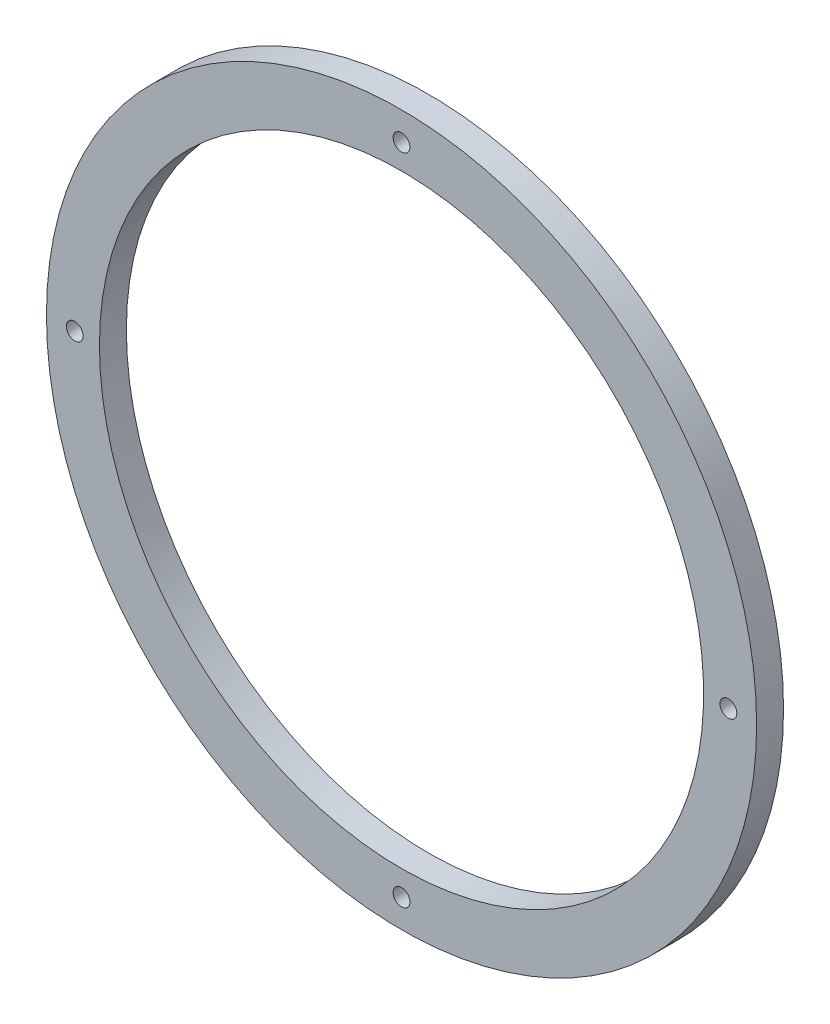
ISO-10303-21;
HEADER;
FILE_DESCRIPTION(('STEP AP214'),'2;1');
FILE_NAME('part.step','',(''),(''),'','','');
FILE_SCHEMA(('AUTOMOTIVE_DESIGN { 1 0 10303 214 1 1 1 1 }'));
ENDSEC;
DATA;
#1=APPLICATION_CONTEXT('core data for automotive mechanical design processes');
#2=APPLICATION_PROTOCOL_DEFINITION('international standard','automotive_design',2000,#1);
#3=PRODUCT_CONTEXT('',#1,'mechanical');
#4=PRODUCT('Part','Part','',(#3));
#5=PRODUCT_RELATED_PRODUCT_CATEGORY('part','',(#4));
#6=PRODUCT_DEFINITION_FORMATION('','',#4);
#7=PRODUCT_DEFINITION_CONTEXT('part definition',#1,'design');
#8=PRODUCT_DEFINITION('design','',#6,#7);
#9=PRODUCT_DEFINITION_SHAPE('','',#8);
#10=(LENGTH_UNIT() NAMED_UNIT(*) SI_UNIT(.MILLI.,.METRE.));
#11=(NAMED_UNIT(*) PLANE_ANGLE_UNIT() SI_UNIT($,.RADIAN.));
#12=(NAMED_UNIT(*) SI_UNIT($,.STERADIAN.) SOLID_ANGLE_UNIT());
#13=UNCERTAINTY_MEASURE_WITH_UNIT(LENGTH_MEASURE(1.E-05),#10,'distance_accuracy_value','');
#14=(GEOMETRIC_REPRESENTATION_CONTEXT(3) GLOBAL_UNCERTAINTY_ASSIGNED_CONTEXT((#13)) GLOBAL_UNIT_ASSIGNED_CONTEXT((#10,
#11,#12)) REPRESENTATION_CONTEXT('',''));
#15=CARTESIAN_POINT('',(0.,0.,0.));
#16=DIRECTION('',(0.,0.,1.));
#17=DIRECTION('',(1.,0.,0.));
#18=AXIS2_PLACEMENT_3D('',#15,#16,#17);
#19=CARTESIAN_POINT('',(0.,0.,7.62));
#20=DIRECTION('',(0.,0.,1.));
#21=DIRECTION('',(1.,0.,0.));
#22=AXIS2_PLACEMENT_3D('',#19,#20,#21);
#23=PLANE('',#22);
#24=CARTESIAN_POINT('',(0.,-92.5,7.62));
#25=DIRECTION('',(0.,0.,1.));
#26=DIRECTION('',(1.,0.,0.));
#27=AXIS2_PLACEMENT_3D('',#24,#25,#26);
#28=CIRCLE('',#27,2.38125);
#29=CARTESIAN_POINT('',(-2.38124999999994,-92.5,7.62));
#30=VERTEX_POINT('',#29);
#31=EDGE_CURVE('E63',#30,#30,#28,.T.);
#32=ORIENTED_EDGE('',*,*,#31,.F.);
#33=EDGE_LOOP('',(#32));
#34=FACE_BOUND('',#33,.T.);
#35=CARTESIAN_POINT('',(0.,92.5,7.62));
#36=DIRECTION('',(0.,0.,1.));
#37=DIRECTION('',(1.,0.,0.));
#38=AXIS2_PLACEMENT_3D('',#35,#36,#37);
#39=CIRCLE('',#38,2.38125);
#40=CARTESIAN_POINT('',(-2.38125,92.5,7.62));
#41=VERTEX_POINT('',#40);
#42=EDGE_CURVE('E51',#41,#41,#39,.T.);
#43=ORIENTED_EDGE('',*,*,#42,.F.);
#44=EDGE_LOOP('',(#43));
#45=FACE_BOUND('',#44,.T.);
#46=CARTESIAN_POINT('',(0.,0.,7.62));
#47=DIRECTION('',(0.,0.,1.));
#48=DIRECTION('',(1.,0.,0.));
#49=AXIS2_PLACEMENT_3D('',#46,#47,#48);
#50=CIRCLE('',#49,100.5);
#51=CARTESIAN_POINT('',(-100.5,0.,7.62));
#52=VERTEX_POINT('',#51);
#53=EDGE_CURVE('E10',#52,#52,#50,.T.);
#54=ORIENTED_EDGE('',*,*,#53,.T.);
#55=EDGE_LOOP('',(#54));
#56=FACE_BOUND('',#55,.T.);
#57=CARTESIAN_POINT('',(0.,0.,7.62));
#58=DIRECTION('',(0.,0.,1.));
#59=DIRECTION('',(1.,0.,0.));
#60=AXIS2_PLACEMENT_3D('',#57,#58,#59);
#61=CIRCLE('',#60,85.5000000000001);
#62=CARTESIAN_POINT('',(-85.5000000000001,0.,7.62));
#63=VERTEX_POINT('',#62);
#64=EDGE_CURVE('E46',#63,#63,#61,.T.);
#65=ORIENTED_EDGE('',*,*,#64,.F.);
#66=EDGE_LOOP('',(#65));
#67=FACE_BOUND('',#66,.T.);
#68=CARTESIAN_POINT('',(92.5,0.,7.62));
#69=DIRECTION('',(0.,0.,1.));
#70=DIRECTION('',(1.,0.,0.));
#71=AXIS2_PLACEMENT_3D('',#68,#69,#70);
#72=CIRCLE('',#71,2.38125000000001);
#73=CARTESIAN_POINT('',(90.11875,0.,7.62));
#74=VERTEX_POINT('',#73);
#75=EDGE_CURVE('E57',#74,#74,#72,.T.);
#76=ORIENTED_EDGE('',*,*,#75,.F.);
#77=EDGE_LOOP('',(#76));
#78=FACE_BOUND('',#77,.T.);
#79=CARTESIAN_POINT('',(-92.5,0.,7.62));
#80=DIRECTION('',(0.,0.,1.));
#81=DIRECTION('',(1.,0.,0.));
#82=AXIS2_PLACEMENT_3D('',#79,#80,#81);
#83=CIRCLE('',#82,2.38125000000001);
#84=CARTESIAN_POINT('',(-94.88125,0.,7.62));
#85=VERTEX_POINT('',#84);
#86=EDGE_CURVE('E69',#85,#85,#83,.T.);
#87=ORIENTED_EDGE('',*,*,#86,.F.);
#88=EDGE_LOOP('',(#87));
#89=FACE_BOUND('',#88,.T.);
#90=ADVANCED_FACE('F35',(#34,#45,#56,#67,#78,#89),#23,.T.);
#91=CARTESIAN_POINT('',(0.,0.,0.));
#92=DIRECTION('',(0.,0.,1.));
#93=DIRECTION('',(1.,0.,0.));
#94=AXIS2_PLACEMENT_3D('',#91,#92,#93);
#95=PLANE('',#94);
#96=CARTESIAN_POINT('',(0.,0.,0.));
#97=DIRECTION('',(0.,0.,1.));
#98=DIRECTION('',(1.,0.,0.));
#99=AXIS2_PLACEMENT_3D('',#96,#97,#98);
#100=CIRCLE('',#99,100.5);
#101=CARTESIAN_POINT('',(-100.5,0.,0.));
#102=VERTEX_POINT('',#101);
#103=EDGE_CURVE('E39',#102,#102,#100,.T.);
#104=ORIENTED_EDGE('',*,*,#103,.F.);
#105=EDGE_LOOP('',(#104));
#106=FACE_BOUND('',#105,.T.);
#107=CARTESIAN_POINT('',(0.,0.,0.));
#108=DIRECTION('',(0.,0.,1.));
#109=DIRECTION('',(1.,0.,0.));
#110=AXIS2_PLACEMENT_3D('',#107,#108,#109);
#111=CIRCLE('',#110,85.5000000000001);
#112=CARTESIAN_POINT('',(-85.5000000000001,0.,0.));
#113=VERTEX_POINT('',#112);
#114=EDGE_CURVE('E48',#113,#113,#111,.T.);
#115=ORIENTED_EDGE('',*,*,#114,.T.);
#116=EDGE_LOOP('',(#115));
#117=FACE_BOUND('',#116,.T.);
#118=CARTESIAN_POINT('',(0.,92.5,0.));
#119=DIRECTION('',(0.,0.,1.));
#120=DIRECTION('',(1.,0.,0.));
#121=AXIS2_PLACEMENT_3D('',#118,#119,#120);
#122=CIRCLE('',#121,2.38125);
#123=CARTESIAN_POINT('',(-2.38125,92.5,0.));
#124=VERTEX_POINT('',#123);
#125=EDGE_CURVE('E54',#124,#124,#122,.T.);
#126=ORIENTED_EDGE('',*,*,#125,.T.);
#127=EDGE_LOOP('',(#126));
#128=FACE_BOUND('',#127,.T.);
#129=CARTESIAN_POINT('',(92.5,0.,0.));
#130=DIRECTION('',(0.,0.,1.));
#131=DIRECTION('',(1.,0.,0.));
#132=AXIS2_PLACEMENT_3D('',#129,#130,#131);
#133=CIRCLE('',#132,2.38125000000001);
#134=CARTESIAN_POINT('',(90.11875,0.,0.));
#135=VERTEX_POINT('',#134);
#136=EDGE_CURVE('E60',#135,#135,#133,.T.);
#137=ORIENTED_EDGE('',*,*,#136,.T.);
#138=EDGE_LOOP('',(#137));
#139=FACE_BOUND('',#138,.T.);
#140=CARTESIAN_POINT('',(0.,-92.5,0.));
#141=DIRECTION('',(0.,0.,1.));
#142=DIRECTION('',(1.,0.,0.));
#143=AXIS2_PLACEMENT_3D('',#140,#141,#142);
#144=CIRCLE('',#143,2.38125);
#145=CARTESIAN_POINT('',(-2.38124999999994,-92.5,0.));
#146=VERTEX_POINT('',#145);
#147=EDGE_CURVE('E66',#146,#146,#144,.T.);
#148=ORIENTED_EDGE('',*,*,#147,.T.);
#149=EDGE_LOOP('',(#148));
#150=FACE_BOUND('',#149,.T.);
#151=CARTESIAN_POINT('',(-92.5,0.,0.));
#152=DIRECTION('',(0.,0.,1.));
#153=DIRECTION('',(1.,0.,0.));
#154=AXIS2_PLACEMENT_3D('',#151,#152,#153);
#155=CIRCLE('',#154,2.38125000000001);
#156=CARTESIAN_POINT('',(-94.88125,0.,0.));
#157=VERTEX_POINT('',#156);
#158=EDGE_CURVE('E72',#157,#157,#155,.T.);
#159=ORIENTED_EDGE('',*,*,#158,.T.);
#160=EDGE_LOOP('',(#159));
#161=FACE_BOUND('',#160,.T.);
#162=ADVANCED_FACE('F82',(#106,#117,#128,#139,#150,#161),#95,.F.);
#163=CARTESIAN_POINT('',(0.,0.,7.62));
#164=DIRECTION('',(0.,0.,-1.));
#165=DIRECTION('',(-1.,0.,0.));
#166=AXIS2_PLACEMENT_3D('',#163,#164,#165);
#167=CYLINDRICAL_SURFACE('',#166,100.5);
#168=CARTESIAN_POINT('',(-100.5,0.,7.62));
#169=CARTESIAN_POINT('',(-100.5,0.,7.540625));
#170=CARTESIAN_POINT('',(-100.5,0.,7.46125));
#171=CARTESIAN_POINT('',(-100.5,0.,7.3025));
#172=CARTESIAN_POINT('',(-100.5,0.,7.223125));
#173=CARTESIAN_POINT('',(-100.5,0.,7.064375));
#174=CARTESIAN_POINT('',(-100.5,0.,6.985));
#175=CARTESIAN_POINT('',(-100.5,0.,6.82625));
#176=CARTESIAN_POINT('',(-100.5,0.,6.746875));
#177=CARTESIAN_POINT('',(-100.5,0.,6.588125));
#178=CARTESIAN_POINT('',(-100.5,0.,6.50875));
#179=CARTESIAN_POINT('',(-100.5,0.,6.35));
#180=CARTESIAN_POINT('',(-100.5,0.,6.270625));
#181=CARTESIAN_POINT('',(-100.5,0.,6.111875));
#182=CARTESIAN_POINT('',(-100.5,0.,6.0325));
#183=CARTESIAN_POINT('',(-100.5,0.,5.87375));
#184=CARTESIAN_POINT('',(-100.5,0.,5.794375));
#185=CARTESIAN_POINT('',(-100.5,0.,5.635625));
#186=CARTESIAN_POINT('',(-100.5,0.,5.55625));
#187=CARTESIAN_POINT('',(-100.5,0.,5.3975));
#188=CARTESIAN_POINT('',(-100.5,0.,5.318125));
#189=CARTESIAN_POINT('',(-100.5,0.,5.159375));
#190=CARTESIAN_POINT('',(-100.5,0.,5.08));
#191=CARTESIAN_POINT('',(-100.5,0.,4.92125));
#192=CARTESIAN_POINT('',(-100.5,0.,4.841875));
#193=CARTESIAN_POINT('',(-100.5,0.,4.683125));
#194=CARTESIAN_POINT('',(-100.5,0.,4.60375));
#195=CARTESIAN_POINT('',(-100.5,0.,4.445));
#196=CARTESIAN_POINT('',(-100.5,0.,4.365625));
#197=CARTESIAN_POINT('',(-100.5,0.,4.206875));
#198=CARTESIAN_POINT('',(-100.5,0.,4.1275));
#199=CARTESIAN_POINT('',(-100.5,0.,3.96875));
#200=CARTESIAN_POINT('',(-100.5,0.,3.889375));
#201=CARTESIAN_POINT('',(-100.5,0.,3.730625));
#202=CARTESIAN_POINT('',(-100.5,0.,3.65125));
#203=CARTESIAN_POINT('',(-100.5,0.,3.4925));
#204=CARTESIAN_POINT('',(-100.5,0.,3.413125));
#205=CARTESIAN_POINT('',(-100.5,0.,3.254375));
#206=CARTESIAN_POINT('',(-100.5,0.,3.175));
#207=CARTESIAN_POINT('',(-100.5,0.,3.01625));
#208=CARTESIAN_POINT('',(-100.5,0.,2.936875));
#209=CARTESIAN_POINT('',(-100.5,0.,2.778125));
#210=CARTESIAN_POINT('',(-100.5,0.,2.69875));
#211=CARTESIAN_POINT('',(-100.5,0.,2.54));
#212=CARTESIAN_POINT('',(-100.5,0.,2.460625));
#213=CARTESIAN_POINT('',(-100.5,0.,2.301875));
#214=CARTESIAN_POINT('',(-100.5,0.,2.2225));
#215=CARTESIAN_POINT('',(-100.5,0.,2.06375));
#216=CARTESIAN_POINT('',(-100.5,0.,1.984375));
#217=CARTESIAN_POINT('',(-100.5,0.,1.825625));
#218=CARTESIAN_POINT('',(-100.5,0.,1.74625));
#219=CARTESIAN_POINT('',(-100.5,0.,1.5875));
#220=CARTESIAN_POINT('',(-100.5,0.,1.508125));
#221=CARTESIAN_POINT('',(-100.5,0.,1.349375));
#222=CARTESIAN_POINT('',(-100.5,0.,1.27));
#223=CARTESIAN_POINT('',(-100.5,0.,1.11125));
#224=CARTESIAN_POINT('',(-100.5,0.,1.031875));
#225=CARTESIAN_POINT('',(-100.5,0.,0.873125));
#226=CARTESIAN_POINT('',(-100.5,0.,0.79375));
#227=CARTESIAN_POINT('',(-100.5,0.,0.635));
#228=CARTESIAN_POINT('',(-100.5,0.,0.555625));
#229=CARTESIAN_POINT('',(-100.5,0.,0.396875));
#230=CARTESIAN_POINT('',(-100.5,0.,0.3175));
#231=CARTESIAN_POINT('',(-100.5,0.,0.15875));
#232=CARTESIAN_POINT('',(-100.5,0.,0.0793749999999999));
#233=CARTESIAN_POINT('',(-100.5,0.,0.));
#234=B_SPLINE_CURVE_WITH_KNOTS('',3,(#168,#169,#170,#171,#172,#173,#174,#175,#176,#177,#178,
#179,#180,#181,#182,#183,#184,#185,#186,#187,#188,#189,#190,#191,#192,#193,#194,#195,#196,#197,
#198,#199,#200,#201,#202,#203,#204,#205,#206,#207,#208,#209,#210,#211,#212,#213,#214,#215,#216,
#217,#218,#219,#220,#221,#222,#223,#224,#225,#226,#227,#228,#229,#230,#231,#232,#233),
.UNSPECIFIED.,.F.,.F.,(4,2,2,2,2,2,2,2,2,2,2,2,2,2,2,2,2,2,2,2,2,2,2,2,2,2,2,2,2,2,2,2,4),(0.,
0.238125,0.476249999999999,0.714375,0.952499999999999,1.190625,1.42875,1.666875,1.905,2.143125,
2.38125,2.619375,2.8575,3.095625,3.33375,3.571875,3.81,4.048125,4.28625,4.524375,4.7625,
5.000625,5.23875,5.476875,5.715,5.953125,6.19125,6.429375,6.6675,6.905625,7.14375,7.381875,
7.62),.UNSPECIFIED.);
#235=EDGE_CURVE('BSEAM37',#52,#102,#234,.T.);
#236=ORIENTED_EDGE('',*,*,#53,.F.);
#237=ORIENTED_EDGE('',*,*,#103,.T.);
#238=ORIENTED_EDGE('',*,*,#235,.T.);
#239=ORIENTED_EDGE('',*,*,#235,.F.);
#240=EDGE_LOOP('',(#236,#238,#237,#239));
#241=FACE_BOUND('',#240,.T.);
#242=ADVANCED_FACE('F37',(#241),#167,.T.);
#243=CARTESIAN_POINT('',(0.,0.,7.62));
#244=DIRECTION('',(0.,0.,-1.));
#245=DIRECTION('',(-1.,0.,0.));
#246=AXIS2_PLACEMENT_3D('',#243,#244,#245);
#247=CYLINDRICAL_SURFACE('',#246,85.5000000000001);
#248=CARTESIAN_POINT('',(-85.5000000000001,0.,7.62));
#249=CARTESIAN_POINT('',(-85.5000000000001,0.,7.540625));
#250=CARTESIAN_POINT('',(-85.5000000000001,0.,7.46125));
#251=CARTESIAN_POINT('',(-85.5000000000001,0.,7.3025));
#252=CARTESIAN_POINT('',(-85.5000000000001,0.,7.223125));
#253=CARTESIAN_POINT('',(-85.5000000000001,0.,7.064375));
#254=CARTESIAN_POINT('',(-85.5000000000001,0.,6.985));
#255=CARTESIAN_POINT('',(-85.5000000000001,0.,6.82625));
#256=CARTESIAN_POINT('',(-85.5000000000001,0.,6.746875));
#257=CARTESIAN_POINT('',(-85.5000000000001,0.,6.588125));
#258=CARTESIAN_POINT('',(-85.5000000000001,0.,6.50875));
#259=CARTESIAN_POINT('',(-85.5000000000001,0.,6.35));
#260=CARTESIAN_POINT('',(-85.5000000000001,0.,6.270625));
#261=CARTESIAN_POINT('',(-85.5000000000001,0.,6.111875));
#262=CARTESIAN_POINT('',(-85.5000000000001,0.,6.0325));
#263=CARTESIAN_POINT('',(-85.5000000000001,0.,5.87375));
#264=CARTESIAN_POINT('',(-85.5000000000001,0.,5.794375));
#265=CARTESIAN_POINT('',(-85.5000000000001,0.,5.635625));
#266=CARTESIAN_POINT('',(-85.5000000000001,0.,5.55625));
#267=CARTESIAN_POINT('',(-85.5000000000001,0.,5.3975));
#268=CARTESIAN_POINT('',(-85.5000000000001,0.,5.318125));
#269=CARTESIAN_POINT('',(-85.5000000000001,0.,5.159375));
#270=CARTESIAN_POINT('',(-85.5000000000001,0.,5.08));
#271=CARTESIAN_POINT('',(-85.5000000000001,0.,4.92125));
#272=CARTESIAN_POINT('',(-85.5000000000001,0.,4.841875));
#273=CARTESIAN_POINT('',(-85.5000000000001,0.,4.683125));
#274=CARTESIAN_POINT('',(-85.5000000000001,0.,4.60375));
#275=CARTESIAN_POINT('',(-85.5000000000001,0.,4.445));
#276=CARTESIAN_POINT('',(-85.5000000000001,0.,4.365625));
#277=CARTESIAN_POINT('',(-85.5000000000001,0.,4.206875));
#278=CARTESIAN_POINT('',(-85.5000000000001,0.,4.1275));
#279=CARTESIAN_POINT('',(-85.5000000000001,0.,3.96875));
#280=CARTESIAN_POINT('',(-85.5000000000001,0.,3.889375));
#281=CARTESIAN_POINT('',(-85.5000000000001,0.,3.730625));
#282=CARTESIAN_POINT('',(-85.5000000000001,0.,3.65125));
#283=CARTESIAN_POINT('',(-85.5000000000001,0.,3.4925));
#284=CARTESIAN_POINT('',(-85.5000000000001,0.,3.413125));
#285=CARTESIAN_POINT('',(-85.5000000000001,0.,3.254375));
#286=CARTESIAN_POINT('',(-85.5000000000001,0.,3.175));
#287=CARTESIAN_POINT('',(-85.5000000000001,0.,3.01625));
#288=CARTESIAN_POINT('',(-85.5000000000001,0.,2.936875));
#289=CARTESIAN_POINT('',(-85.5000000000001,0.,2.778125));
#290=CARTESIAN_POINT('',(-85.5000000000001,0.,2.69875));
#291=CARTESIAN_POINT('',(-85.5000000000001,0.,2.54));
#292=CARTESIAN_POINT('',(-85.5000000000001,0.,2.460625));
#293=CARTESIAN_POINT('',(-85.5000000000001,0.,2.301875));
#294=CARTESIAN_POINT('',(-85.5000000000001,0.,2.2225));
#295=CARTESIAN_POINT('',(-85.5000000000001,0.,2.06375));
#296=CARTESIAN_POINT('',(-85.5000000000001,0.,1.984375));
#297=CARTESIAN_POINT('',(-85.5000000000001,0.,1.825625));
#298=CARTESIAN_POINT('',(-85.5000000000001,0.,1.74625));
#299=CARTESIAN_POINT('',(-85.5000000000001,0.,1.5875));
#300=CARTESIAN_POINT('',(-85.5000000000001,0.,1.508125));
#301=CARTESIAN_POINT('',(-85.5000000000001,0.,1.349375));
#302=CARTESIAN_POINT('',(-85.5000000000001,0.,1.27));
#303=CARTESIAN_POINT('',(-85.5000000000001,0.,1.11125));
#304=CARTESIAN_POINT('',(-85.5000000000001,0.,1.031875));
#305=CARTESIAN_POINT('',(-85.5000000000001,0.,0.873125));
#306=CARTESIAN_POINT('',(-85.5000000000001,0.,0.79375));
#307=CARTESIAN_POINT('',(-85.5000000000001,0.,0.635));
#308=CARTESIAN_POINT('',(-85.5000000000001,0.,0.555625));
#309=CARTESIAN_POINT('',(-85.5000000000001,0.,0.396875));
#310=CARTESIAN_POINT('',(-85.5000000000001,0.,0.3175));
#311=CARTESIAN_POINT('',(-85.5000000000001,0.,0.15875));
#312=CARTESIAN_POINT('',(-85.5000000000001,0.,0.0793749999999999));
#313=CARTESIAN_POINT('',(-85.5000000000001,0.,0.));
#314=B_SPLINE_CURVE_WITH_KNOTS('',3,(#248,#249,#250,#251,#252,#253,#254,#255,#256,#257,#258,
#259,#260,#261,#262,#263,#264,#265,#266,#267,#268,#269,#270,#271,#272,#273,#274,#275,#276,#277,
#278,#279,#280,#281,#282,#283,#284,#285,#286,#287,#288,#289,#290,#291,#292,#293,#294,#295,#296,
#297,#298,#299,#300,#301,#302,#303,#304,#305,#306,#307,#308,#309,#310,#311,#312,#313),
.UNSPECIFIED.,.F.,.F.,(4,2,2,2,2,2,2,2,2,2,2,2,2,2,2,2,2,2,2,2,2,2,2,2,2,2,2,2,2,2,2,2,4),(0.,
0.238125,0.476249999999999,0.714375,0.952499999999999,1.190625,1.42875,1.666875,1.905,2.143125,
2.38125,2.619375,2.8575,3.095625,3.33375,3.571875,3.81,4.048125,4.28625,4.524375,4.7625,
5.000625,5.23875,5.476875,5.715,5.953125,6.19125,6.429375,6.6675,6.905625,7.14375,7.381875,
7.62),.UNSPECIFIED.);
#315=EDGE_CURVE('BSEAM92',#63,#113,#314,.T.);
#316=ORIENTED_EDGE('',*,*,#64,.T.);
#317=ORIENTED_EDGE('',*,*,#114,.F.);
#318=ORIENTED_EDGE('',*,*,#315,.T.);
#319=ORIENTED_EDGE('',*,*,#315,.F.);
#320=EDGE_LOOP('',(#316,#318,#317,#319));
#321=FACE_BOUND('',#320,.T.);
#322=ADVANCED_FACE('F92',(#321),#247,.F.);
#323=CARTESIAN_POINT('',(0.,92.5,7.62));
#324=DIRECTION('',(0.,0.,-1.));
#325=DIRECTION('',(-1.,0.,0.));
#326=AXIS2_PLACEMENT_3D('',#323,#324,#325);
#327=CYLINDRICAL_SURFACE('',#326,2.38125);
#328=CARTESIAN_POINT('',(-2.38125,92.5,7.62));
#329=CARTESIAN_POINT('',(-2.38125,92.5,7.540625));
#330=CARTESIAN_POINT('',(-2.38125,92.5,7.46125));
#331=CARTESIAN_POINT('',(-2.38125,92.5,7.3025));
#332=CARTESIAN_POINT('',(-2.38125,92.5,7.223125));
#333=CARTESIAN_POINT('',(-2.38125,92.5,7.064375));
#334=CARTESIAN_POINT('',(-2.38125,92.5,6.985));
#335=CARTESIAN_POINT('',(-2.38125,92.5,6.82625));
#336=CARTESIAN_POINT('',(-2.38125,92.5,6.746875));
#337=CARTESIAN_POINT('',(-2.38125,92.5,6.588125));
#338=CARTESIAN_POINT('',(-2.38125,92.5,6.50875));
#339=CARTESIAN_POINT('',(-2.38125,92.5,6.35));
#340=CARTESIAN_POINT('',(-2.38125,92.5,6.270625));
#341=CARTESIAN_POINT('',(-2.38125,92.5,6.111875));
#342=CARTESIAN_POINT('',(-2.38125,92.5,6.0325));
#343=CARTESIAN_POINT('',(-2.38125,92.5,5.87375));
#344=CARTESIAN_POINT('',(-2.38125,92.5,5.794375));
#345=CARTESIAN_POINT('',(-2.38125,92.5,5.635625));
#346=CARTESIAN_POINT('',(-2.38125,92.5,5.55625));
#347=CARTESIAN_POINT('',(-2.38125,92.5,5.3975));
#348=CARTESIAN_POINT('',(-2.38125,92.5,5.318125));
#349=CARTESIAN_POINT('',(-2.38125,92.5,5.159375));
#350=CARTESIAN_POINT('',(-2.38125,92.5,5.08));
#351=CARTESIAN_POINT('',(-2.38125,92.5,4.92125));
#352=CARTESIAN_POINT('',(-2.38125,92.5,4.841875));
#353=CARTESIAN_POINT('',(-2.38125,92.5,4.683125));
#354=CARTESIAN_POINT('',(-2.38125,92.5,4.60375));
#355=CARTESIAN_POINT('',(-2.38125,92.5,4.445));
#356=CARTESIAN_POINT('',(-2.38125,92.5,4.365625));
#357=CARTESIAN_POINT('',(-2.38125,92.5,4.206875));
#358=CARTESIAN_POINT('',(-2.38125,92.5,4.1275));
#359=CARTESIAN_POINT('',(-2.38125,92.5,3.96875));
#360=CARTESIAN_POINT('',(-2.38125,92.5,3.889375));
#361=CARTESIAN_POINT('',(-2.38125,92.5,3.730625));
#362=CARTESIAN_POINT('',(-2.38125,92.5,3.65125));
#363=CARTESIAN_POINT('',(-2.38125,92.5,3.4925));
#364=CARTESIAN_POINT('',(-2.38125,92.5,3.413125));
#365=CARTESIAN_POINT('',(-2.38125,92.5,3.254375));
#366=CARTESIAN_POINT('',(-2.38125,92.5,3.175));
#367=CARTESIAN_POINT('',(-2.38125,92.5,3.01625));
#368=CARTESIAN_POINT('',(-2.38125,92.5,2.936875));
#369=CARTESIAN_POINT('',(-2.38125,92.5,2.778125));
#370=CARTESIAN_POINT('',(-2.38125,92.5,2.69875));
#371=CARTESIAN_POINT('',(-2.38125,92.5,2.54));
#372=CARTESIAN_POINT('',(-2.38125,92.5,2.460625));
#373=CARTESIAN_POINT('',(-2.38125,92.5,2.301875));
#374=CARTESIAN_POINT('',(-2.38125,92.5,2.2225));
#375=CARTESIAN_POINT('',(-2.38125,92.5,2.06375));
#376=CARTESIAN_POINT('',(-2.38125,92.5,1.984375));
#377=CARTESIAN_POINT('',(-2.38125,92.5,1.825625));
#378=CARTESIAN_POINT('',(-2.38125,92.5,1.74625));
#379=CARTESIAN_POINT('',(-2.38125,92.5,1.5875));
#380=CARTESIAN_POINT('',(-2.38125,92.5,1.508125));
#381=CARTESIAN_POINT('',(-2.38125,92.5,1.349375));
#382=CARTESIAN_POINT('',(-2.38125,92.5,1.27));
#383=CARTESIAN_POINT('',(-2.38125,92.5,1.11125));
#384=CARTESIAN_POINT('',(-2.38125,92.5,1.031875));
#385=CARTESIAN_POINT('',(-2.38125,92.5,0.873125));
#386=CARTESIAN_POINT('',(-2.38125,92.5,0.79375));
#387=CARTESIAN_POINT('',(-2.38125,92.5,0.635));
#388=CARTESIAN_POINT('',(-2.38125,92.5,0.555625));
#389=CARTESIAN_POINT('',(-2.38125,92.5,0.396875));
#390=CARTESIAN_POINT('',(-2.38125,92.5,0.3175));
#391=CARTESIAN_POINT('',(-2.38125,92.5,0.15875));
#392=CARTESIAN_POINT('',(-2.38125,92.5,0.0793749999999999));
#393=CARTESIAN_POINT('',(-2.38125,92.5,0.));
#394=B_SPLINE_CURVE_WITH_KNOTS('',3,(#328,#329,#330,#331,#332,#333,#334,#335,#336,#337,#338,
#339,#340,#341,#342,#343,#344,#345,#346,#347,#348,#349,#350,#351,#352,#353,#354,#355,#356,#357,
#358,#359,#360,#361,#362,#363,#364,#365,#366,#367,#368,#369,#370,#371,#372,#373,#374,#375,#376,
#377,#378,#379,#380,#381,#382,#383,#384,#385,#386,#387,#388,#389,#390,#391,#392,#393),
.UNSPECIFIED.,.F.,.F.,(4,2,2,2,2,2,2,2,2,2,2,2,2,2,2,2,2,2,2,2,2,2,2,2,2,2,2,2,2,2,2,2,4),(0.,
0.238125,0.47625,0.714375000000001,0.9525,1.190625,1.42875,1.666875,1.905,2.143125,2.38125,
2.619375,2.8575,3.095625,3.33375,3.571875,3.81,4.048125,4.28625,4.524375,4.7625,5.000625,
5.23875,5.476875,5.715,5.953125,6.19125,6.429375,6.6675,6.905625,7.14375,7.381875,7.62),.UNSPECIFIED.);
#395=EDGE_CURVE('BSEAM95',#41,#124,#394,.T.);
#396=ORIENTED_EDGE('',*,*,#42,.T.);
#397=ORIENTED_EDGE('',*,*,#125,.F.);
#398=ORIENTED_EDGE('',*,*,#395,.T.);
#399=ORIENTED_EDGE('',*,*,#395,.F.);
#400=EDGE_LOOP('',(#396,#398,#397,#399));
#401=FACE_BOUND('',#400,.T.);
#402=ADVANCED_FACE('F95',(#401),#327,.F.);
#403=CARTESIAN_POINT('',(92.5,0.,7.62));
#404=DIRECTION('',(0.,0.,-1.));
#405=DIRECTION('',(-1.,0.,0.));
#406=AXIS2_PLACEMENT_3D('',#403,#404,#405);
#407=CYLINDRICAL_SURFACE('',#406,2.38125000000001);
#408=CARTESIAN_POINT('',(90.11875,0.,7.62));
#409=CARTESIAN_POINT('',(90.11875,0.,7.540625));
#410=CARTESIAN_POINT('',(90.11875,0.,7.46125));
#411=CARTESIAN_POINT('',(90.11875,0.,7.3025));
#412=CARTESIAN_POINT('',(90.11875,0.,7.223125));
#413=CARTESIAN_POINT('',(90.11875,0.,7.064375));
#414=CARTESIAN_POINT('',(90.11875,0.,6.985));
#415=CARTESIAN_POINT('',(90.11875,0.,6.82625));
#416=CARTESIAN_POINT('',(90.11875,0.,6.746875));
#417=CARTESIAN_POINT('',(90.11875,0.,6.588125));
#418=CARTESIAN_POINT('',(90.11875,0.,6.50875));
#419=CARTESIAN_POINT('',(90.11875,0.,6.35));
#420=CARTESIAN_POINT('',(90.11875,0.,6.270625));
#421=CARTESIAN_POINT('',(90.11875,0.,6.111875));
#422=CARTESIAN_POINT('',(90.11875,0.,6.0325));
#423=CARTESIAN_POINT('',(90.11875,0.,5.87375));
#424=CARTESIAN_POINT('',(90.11875,0.,5.794375));
#425=CARTESIAN_POINT('',(90.11875,0.,5.635625));
#426=CARTESIAN_POINT('',(90.11875,0.,5.55625));
#427=CARTESIAN_POINT('',(90.11875,0.,5.3975));
#428=CARTESIAN_POINT('',(90.11875,0.,5.318125));
#429=CARTESIAN_POINT('',(90.11875,0.,5.159375));
#430=CARTESIAN_POINT('',(90.11875,0.,5.08));
#431=CARTESIAN_POINT('',(90.11875,0.,4.92125));
#432=CARTESIAN_POINT('',(90.11875,0.,4.841875));
#433=CARTESIAN_POINT('',(90.11875,0.,4.683125));
#434=CARTESIAN_POINT('',(90.11875,0.,4.60375));
#435=CARTESIAN_POINT('',(90.11875,0.,4.445));
#436=CARTESIAN_POINT('',(90.11875,0.,4.365625));
#437=CARTESIAN_POINT('',(90.11875,0.,4.206875));
#438=CARTESIAN_POINT('',(90.11875,0.,4.1275));
#439=CARTESIAN_POINT('',(90.11875,0.,3.96875));
#440=CARTESIAN_POINT('',(90.11875,0.,3.889375));
#441=CARTESIAN_POINT('',(90.11875,0.,3.730625));
#442=CARTESIAN_POINT('',(90.11875,0.,3.65125));
#443=CARTESIAN_POINT('',(90.11875,0.,3.4925));
#444=CARTESIAN_POINT('',(90.11875,0.,3.413125));
#445=CARTESIAN_POINT('',(90.11875,0.,3.254375));
#446=CARTESIAN_POINT('',(90.11875,0.,3.175));
#447=CARTESIAN_POINT('',(90.11875,0.,3.01625));
#448=CARTESIAN_POINT('',(90.11875,0.,2.936875));
#449=CARTESIAN_POINT('',(90.11875,0.,2.778125));
#450=CARTESIAN_POINT('',(90.11875,0.,2.69875));
#451=CARTESIAN_POINT('',(90.11875,0.,2.54));
#452=CARTESIAN_POINT('',(90.11875,0.,2.460625));
#453=CARTESIAN_POINT('',(90.11875,0.,2.301875));
#454=CARTESIAN_POINT('',(90.11875,0.,2.2225));
#455=CARTESIAN_POINT('',(90.11875,0.,2.06375));
#456=CARTESIAN_POINT('',(90.11875,0.,1.984375));
#457=CARTESIAN_POINT('',(90.11875,0.,1.825625));
#458=CARTESIAN_POINT('',(90.11875,0.,1.74625));
#459=CARTESIAN_POINT('',(90.11875,0.,1.5875));
#460=CARTESIAN_POINT('',(90.11875,0.,1.508125));
#461=CARTESIAN_POINT('',(90.11875,0.,1.349375));
#462=CARTESIAN_POINT('',(90.11875,0.,1.27));
#463=CARTESIAN_POINT('',(90.11875,0.,1.11125));
#464=CARTESIAN_POINT('',(90.11875,0.,1.031875));
#465=CARTESIAN_POINT('',(90.11875,0.,0.873125));
#466=CARTESIAN_POINT('',(90.11875,0.,0.79375));
#467=CARTESIAN_POINT('',(90.11875,0.,0.635));
#468=CARTESIAN_POINT('',(90.11875,0.,0.555625));
#469=CARTESIAN_POINT('',(90.11875,0.,0.396875));
#470=CARTESIAN_POINT('',(90.11875,0.,0.3175));
#471=CARTESIAN_POINT('',(90.11875,0.,0.15875));
#472=CARTESIAN_POINT('',(90.11875,0.,0.0793749999999999));
#473=CARTESIAN_POINT('',(90.11875,0.,0.));
#474=B_SPLINE_CURVE_WITH_KNOTS('',3,(#408,#409,#410,#411,#412,#413,#414,#415,#416,#417,#418,
#419,#420,#421,#422,#423,#424,#425,#426,#427,#428,#429,#430,#431,#432,#433,#434,#435,#436,#437,
#438,#439,#440,#441,#442,#443,#444,#445,#446,#447,#448,#449,#450,#451,#452,#453,#454,#455,#456,
#457,#458,#459,#460,#461,#462,#463,#464,#465,#466,#467,#468,#469,#470,#471,#472,#473),
.UNSPECIFIED.,.F.,.F.,(4,2,2,2,2,2,2,2,2,2,2,2,2,2,2,2,2,2,2,2,2,2,2,2,2,2,2,2,2,2,2,2,4),(0.,
0.238125,0.47625,0.714375000000001,0.9525,1.190625,1.42875,1.666875,1.905,2.143125,2.38125,
2.619375,2.8575,3.095625,3.33375,3.571875,3.81,4.048125,4.28625,4.524375,4.7625,5.000625,
5.23875,5.476875,5.715,5.953125,6.19125,6.429375,6.6675,6.905625,7.14375,7.381875,7.62),.UNSPECIFIED.);
#475=EDGE_CURVE('BSEAM99',#74,#135,#474,.T.);
#476=ORIENTED_EDGE('',*,*,#75,.T.);
#477=ORIENTED_EDGE('',*,*,#136,.F.);
#478=ORIENTED_EDGE('',*,*,#475,.T.);
#479=ORIENTED_EDGE('',*,*,#475,.F.);
#480=EDGE_LOOP('',(#476,#478,#477,#479));
#481=FACE_BOUND('',#480,.T.);
#482=ADVANCED_FACE('F99',(#481),#407,.F.);
#483=CARTESIAN_POINT('',(0.,-92.5,7.62));
#484=DIRECTION('',(0.,0.,-1.));
#485=DIRECTION('',(-1.,0.,0.));
#486=AXIS2_PLACEMENT_3D('',#483,#484,#485);
#487=CYLINDRICAL_SURFACE('',#486,2.38125);
#488=CARTESIAN_POINT('',(-2.38124999999994,-92.5,7.62));
#489=CARTESIAN_POINT('',(-2.38124999999994,-92.5,7.540625));
#490=CARTESIAN_POINT('',(-2.38124999999994,-92.5,7.46125));
#491=CARTESIAN_POINT('',(-2.38124999999994,-92.5,7.3025));
#492=CARTESIAN_POINT('',(-2.38124999999994,-92.5,7.223125));
#493=CARTESIAN_POINT('',(-2.38124999999994,-92.5,7.064375));
#494=CARTESIAN_POINT('',(-2.38124999999994,-92.5,6.985));
#495=CARTESIAN_POINT('',(-2.38124999999994,-92.5,6.82625));
#496=CARTESIAN_POINT('',(-2.38124999999994,-92.5,6.746875));
#497=CARTESIAN_POINT('',(-2.38124999999994,-92.5,6.588125));
#498=CARTESIAN_POINT('',(-2.38124999999994,-92.5,6.50875));
#499=CARTESIAN_POINT('',(-2.38124999999994,-92.5,6.35));
#500=CARTESIAN_POINT('',(-2.38124999999994,-92.5,6.270625));
#501=CARTESIAN_POINT('',(-2.38124999999994,-92.5,6.111875));
#502=CARTESIAN_POINT('',(-2.38124999999994,-92.5,6.0325));
#503=CARTESIAN_POINT('',(-2.38124999999994,-92.5,5.87375));
#504=CARTESIAN_POINT('',(-2.38124999999994,-92.5,5.794375));
#505=CARTESIAN_POINT('',(-2.38124999999994,-92.5,5.635625));
#506=CARTESIAN_POINT('',(-2.38124999999994,-92.5,5.55625));
#507=CARTESIAN_POINT('',(-2.38124999999994,-92.5,5.3975));
#508=CARTESIAN_POINT('',(-2.38124999999994,-92.5,5.318125));
#509=CARTESIAN_POINT('',(-2.38124999999994,-92.5,5.159375));
#510=CARTESIAN_POINT('',(-2.38124999999994,-92.5,5.08));
#511=CARTESIAN_POINT('',(-2.38124999999994,-92.5,4.92125));
#512=CARTESIAN_POINT('',(-2.38124999999994,-92.5,4.841875));
#513=CARTESIAN_POINT('',(-2.38124999999994,-92.5,4.683125));
#514=CARTESIAN_POINT('',(-2.38124999999994,-92.5,4.60375));
#515=CARTESIAN_POINT('',(-2.38124999999994,-92.5,4.445));
#516=CARTESIAN_POINT('',(-2.38124999999994,-92.5,4.365625));
#517=CARTESIAN_POINT('',(-2.38124999999994,-92.5,4.206875));
#518=CARTESIAN_POINT('',(-2.38124999999994,-92.5,4.1275));
#519=CARTESIAN_POINT('',(-2.38124999999994,-92.5,3.96875));
#520=CARTESIAN_POINT('',(-2.38124999999994,-92.5,3.889375));
#521=CARTESIAN_POINT('',(-2.38124999999994,-92.5,3.730625));
#522=CARTESIAN_POINT('',(-2.38124999999994,-92.5,3.65125));
#523=CARTESIAN_POINT('',(-2.38124999999994,-92.5,3.4925));
#524=CARTESIAN_POINT('',(-2.38124999999994,-92.5,3.413125));
#525=CARTESIAN_POINT('',(-2.38124999999994,-92.5,3.254375));
#526=CARTESIAN_POINT('',(-2.38124999999994,-92.5,3.175));
#527=CARTESIAN_POINT('',(-2.38124999999994,-92.5,3.01625));
#528=CARTESIAN_POINT('',(-2.38124999999994,-92.5,2.936875));
#529=CARTESIAN_POINT('',(-2.38124999999994,-92.5,2.778125));
#530=CARTESIAN_POINT('',(-2.38124999999994,-92.5,2.69875));
#531=CARTESIAN_POINT('',(-2.38124999999994,-92.5,2.54));
#532=CARTESIAN_POINT('',(-2.38124999999994,-92.5,2.460625));
#533=CARTESIAN_POINT('',(-2.38124999999994,-92.5,2.301875));
#534=CARTESIAN_POINT('',(-2.38124999999994,-92.5,2.2225));
#535=CARTESIAN_POINT('',(-2.38124999999994,-92.5,2.06375));
#536=CARTESIAN_POINT('',(-2.38124999999994,-92.5,1.984375));
#537=CARTESIAN_POINT('',(-2.38124999999994,-92.5,1.825625));
#538=CARTESIAN_POINT('',(-2.38124999999994,-92.5,1.74625));
#539=CARTESIAN_POINT('',(-2.38124999999994,-92.5,1.5875));
#540=CARTESIAN_POINT('',(-2.38124999999994,-92.5,1.508125));
#541=CARTESIAN_POINT('',(-2.38124999999994,-92.5,1.349375));
#542=CARTESIAN_POINT('',(-2.38124999999994,-92.5,1.27));
#543=CARTESIAN_POINT('',(-2.38124999999994,-92.5,1.11125));
#544=CARTESIAN_POINT('',(-2.38124999999994,-92.5,1.031875));
#545=CARTESIAN_POINT('',(-2.38124999999994,-92.5,0.873125));
#546=CARTESIAN_POINT('',(-2.38124999999994,-92.5,0.79375));
#547=CARTESIAN_POINT('',(-2.38124999999994,-92.5,0.635));
#548=CARTESIAN_POINT('',(-2.38124999999994,-92.5,0.555625));
#549=CARTESIAN_POINT('',(-2.38124999999994,-92.5,0.396875));
#550=CARTESIAN_POINT('',(-2.38124999999994,-92.5,0.3175));
#551=CARTESIAN_POINT('',(-2.38124999999994,-92.5,0.15875));
#552=CARTESIAN_POINT('',(-2.38124999999994,-92.5,0.0793749999999999));
#553=CARTESIAN_POINT('',(-2.38124999999994,-92.5,0.));
#554=B_SPLINE_CURVE_WITH_KNOTS('',3,(#488,#489,#490,#491,#492,#493,#494,#495,#496,#497,#498,
#499,#500,#501,#502,#503,#504,#505,#506,#507,#508,#509,#510,#511,#512,#513,#514,#515,#516,#517,
#518,#519,#520,#521,#522,#523,#524,#525,#526,#527,#528,#529,#530,#531,#532,#533,#534,#535,#536,
#537,#538,#539,#540,#541,#542,#543,#544,#545,#546,#547,#548,#549,#550,#551,#552,#553),
.UNSPECIFIED.,.F.,.F.,(4,2,2,2,2,2,2,2,2,2,2,2,2,2,2,2,2,2,2,2,2,2,2,2,2,2,2,2,2,2,2,2,4),(0.,
0.238125,0.47625,0.714375000000001,0.9525,1.190625,1.42875,1.666875,1.905,2.143125,2.38125,
2.619375,2.8575,3.095625,3.33375,3.571875,3.81,4.048125,4.28625,4.524375,4.7625,5.000625,
5.23875,5.476875,5.715,5.953125,6.19125,6.429375,6.6675,6.905625,7.14375,7.381875,7.62),.UNSPECIFIED.);
#555=EDGE_CURVE('BSEAM103',#30,#146,#554,.T.);
#556=ORIENTED_EDGE('',*,*,#31,.T.);
#557=ORIENTED_EDGE('',*,*,#147,.F.);
#558=ORIENTED_EDGE('',*,*,#555,.T.);
#559=ORIENTED_EDGE('',*,*,#555,.F.);
#560=EDGE_LOOP('',(#556,#558,#557,#559));
#561=FACE_BOUND('',#560,.T.);
#562=ADVANCED_FACE('F103',(#561),#487,.F.);
#563=CARTESIAN_POINT('',(-92.5,0.,7.62));
#564=DIRECTION('',(0.,0.,-1.));
#565=DIRECTION('',(-1.,0.,0.));
#566=AXIS2_PLACEMENT_3D('',#563,#564,#565);
#567=CYLINDRICAL_SURFACE('',#566,2.38125000000001);
#568=CARTESIAN_POINT('',(-94.88125,0.,7.62));
#569=CARTESIAN_POINT('',(-94.88125,0.,7.540625));
#570=CARTESIAN_POINT('',(-94.88125,0.,7.46125));
#571=CARTESIAN_POINT('',(-94.88125,0.,7.3025));
#572=CARTESIAN_POINT('',(-94.88125,0.,7.223125));
#573=CARTESIAN_POINT('',(-94.88125,0.,7.064375));
#574=CARTESIAN_POINT('',(-94.88125,0.,6.985));
#575=CARTESIAN_POINT('',(-94.88125,0.,6.82625));
#576=CARTESIAN_POINT('',(-94.88125,0.,6.746875));
#577=CARTESIAN_POINT('',(-94.88125,0.,6.588125));
#578=CARTESIAN_POINT('',(-94.88125,0.,6.50875));
#579=CARTESIAN_POINT('',(-94.88125,0.,6.35));
#580=CARTESIAN_POINT('',(-94.88125,0.,6.270625));
#581=CARTESIAN_POINT('',(-94.88125,0.,6.111875));
#582=CARTESIAN_POINT('',(-94.88125,0.,6.0325));
#583=CARTESIAN_POINT('',(-94.88125,0.,5.87375));
#584=CARTESIAN_POINT('',(-94.88125,0.,5.794375));
#585=CARTESIAN_POINT('',(-94.88125,0.,5.635625));
#586=CARTESIAN_POINT('',(-94.88125,0.,5.55625));
#587=CARTESIAN_POINT('',(-94.88125,0.,5.3975));
#588=CARTESIAN_POINT('',(-94.88125,0.,5.318125));
#589=CARTESIAN_POINT('',(-94.88125,0.,5.159375));
#590=CARTESIAN_POINT('',(-94.88125,0.,5.08));
#591=CARTESIAN_POINT('',(-94.88125,0.,4.92125));
#592=CARTESIAN_POINT('',(-94.88125,0.,4.841875));
#593=CARTESIAN_POINT('',(-94.88125,0.,4.683125));
#594=CARTESIAN_POINT('',(-94.88125,0.,4.60375));
#595=CARTESIAN_POINT('',(-94.88125,0.,4.445));
#596=CARTESIAN_POINT('',(-94.88125,0.,4.365625));
#597=CARTESIAN_POINT('',(-94.88125,0.,4.206875));
#598=CARTESIAN_POINT('',(-94.88125,0.,4.1275));
#599=CARTESIAN_POINT('',(-94.88125,0.,3.96875));
#600=CARTESIAN_POINT('',(-94.88125,0.,3.889375));
#601=CARTESIAN_POINT('',(-94.88125,0.,3.730625));
#602=CARTESIAN_POINT('',(-94.88125,0.,3.65125));
#603=CARTESIAN_POINT('',(-94.88125,0.,3.4925));
#604=CARTESIAN_POINT('',(-94.88125,0.,3.413125));
#605=CARTESIAN_POINT('',(-94.88125,0.,3.254375));
#606=CARTESIAN_POINT('',(-94.88125,0.,3.175));
#607=CARTESIAN_POINT('',(-94.88125,0.,3.01625));
#608=CARTESIAN_POINT('',(-94.88125,0.,2.936875));
#609=CARTESIAN_POINT('',(-94.88125,0.,2.778125));
#610=CARTESIAN_POINT('',(-94.88125,0.,2.69875));
#611=CARTESIAN_POINT('',(-94.88125,0.,2.54));
#612=CARTESIAN_POINT('',(-94.88125,0.,2.460625));
#613=CARTESIAN_POINT('',(-94.88125,0.,2.301875));
#614=CARTESIAN_POINT('',(-94.88125,0.,2.2225));
#615=CARTESIAN_POINT('',(-94.88125,0.,2.06375));
#616=CARTESIAN_POINT('',(-94.88125,0.,1.984375));
#617=CARTESIAN_POINT('',(-94.88125,0.,1.825625));
#618=CARTESIAN_POINT('',(-94.88125,0.,1.74625));
#619=CARTESIAN_POINT('',(-94.88125,0.,1.5875));
#620=CARTESIAN_POINT('',(-94.88125,0.,1.508125));
#621=CARTESIAN_POINT('',(-94.88125,0.,1.349375));
#622=CARTESIAN_POINT('',(-94.88125,0.,1.27));
#623=CARTESIAN_POINT('',(-94.88125,0.,1.11125));
#624=CARTESIAN_POINT('',(-94.88125,0.,1.031875));
#625=CARTESIAN_POINT('',(-94.88125,0.,0.873125));
#626=CARTESIAN_POINT('',(-94.88125,0.,0.79375));
#627=CARTESIAN_POINT('',(-94.88125,0.,0.635));
#628=CARTESIAN_POINT('',(-94.88125,0.,0.555625));
#629=CARTESIAN_POINT('',(-94.88125,0.,0.396875));
#630=CARTESIAN_POINT('',(-94.88125,0.,0.3175));
#631=CARTESIAN_POINT('',(-94.88125,0.,0.15875));
#632=CARTESIAN_POINT('',(-94.88125,0.,0.0793749999999999));
#633=CARTESIAN_POINT('',(-94.88125,0.,0.));
#634=B_SPLINE_CURVE_WITH_KNOTS('',3,(#568,#569,#570,#571,#572,#573,#574,#575,#576,#577,#578,
#579,#580,#581,#582,#583,#584,#585,#586,#587,#588,#589,#590,#591,#592,#593,#594,#595,#596,#597,
#598,#599,#600,#601,#602,#603,#604,#605,#606,#607,#608,#609,#610,#611,#612,#613,#614,#615,#616,
#617,#618,#619,#620,#621,#622,#623,#624,#625,#626,#627,#628,#629,#630,#631,#632,#633),
.UNSPECIFIED.,.F.,.F.,(4,2,2,2,2,2,2,2,2,2,2,2,2,2,2,2,2,2,2,2,2,2,2,2,2,2,2,2,2,2,2,2,4),(0.,
0.238125,0.47625,0.714375000000001,0.9525,1.190625,1.42875,1.666875,1.905,2.143125,2.38125,
2.619375,2.8575,3.095625,3.33375,3.571875,3.81,4.048125,4.28625,4.524375,4.7625,5.000625,
5.23875,5.476875,5.715,5.953125,6.19125,6.429375,6.6675,6.905625,7.14375,7.381875,7.62),.UNSPECIFIED.);
#635=EDGE_CURVE('BSEAM78',#85,#157,#634,.T.);
#636=ORIENTED_EDGE('',*,*,#86,.T.);
#637=ORIENTED_EDGE('',*,*,#158,.F.);
#638=ORIENTED_EDGE('',*,*,#635,.T.);
#639=ORIENTED_EDGE('',*,*,#635,.F.);
#640=EDGE_LOOP('',(#636,#638,#637,#639));
#641=FACE_BOUND('',#640,.T.);
#642=ADVANCED_FACE('F78',(#641),#567,.F.);
#643=CLOSED_SHELL('',(#90,#162,#242,#322,#402,#482,#562,#642));
#644=MANIFOLD_SOLID_BREP('B2',#643);
#645=ADVANCED_BREP_SHAPE_REPRESENTATION('',(#18,#644),#14);
#646=SHAPE_DEFINITION_REPRESENTATION(#9,#645);
ENDSEC;
END-ISO-10303-21;
